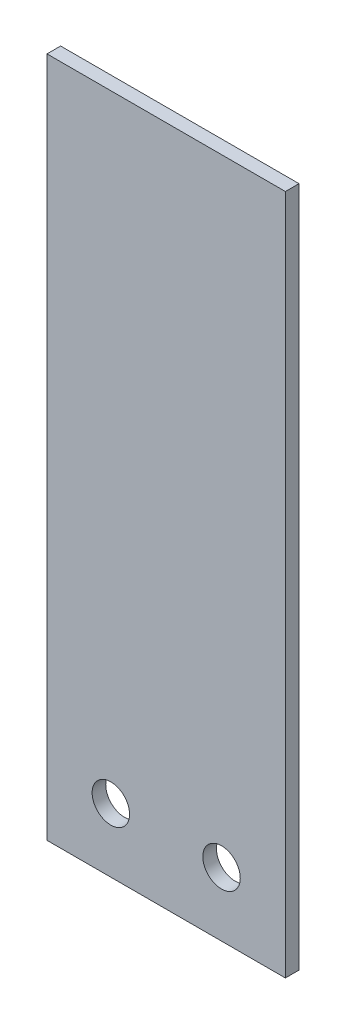
ISO-10303-21;
HEADER;
FILE_DESCRIPTION(('STEP AP214'),'2;1');
FILE_NAME('part.step','',(''),(''),'','','');
FILE_SCHEMA(('AUTOMOTIVE_DESIGN { 1 0 10303 214 1 1 1 1 }'));
ENDSEC;
DATA;
#1=APPLICATION_CONTEXT('core data for automotive mechanical design processes');
#2=APPLICATION_PROTOCOL_DEFINITION('international standard','automotive_design',2000,#1);
#3=PRODUCT_CONTEXT('',#1,'mechanical');
#4=PRODUCT('Part','Part','',(#3));
#5=PRODUCT_RELATED_PRODUCT_CATEGORY('part','',(#4));
#6=PRODUCT_DEFINITION_FORMATION('','',#4);
#7=PRODUCT_DEFINITION_CONTEXT('part definition',#1,'design');
#8=PRODUCT_DEFINITION('design','',#6,#7);
#9=PRODUCT_DEFINITION_SHAPE('','',#8);
#10=(LENGTH_UNIT() NAMED_UNIT(*) SI_UNIT(.MILLI.,.METRE.));
#11=(NAMED_UNIT(*) PLANE_ANGLE_UNIT() SI_UNIT($,.RADIAN.));
#12=(NAMED_UNIT(*) SI_UNIT($,.STERADIAN.) SOLID_ANGLE_UNIT());
#13=UNCERTAINTY_MEASURE_WITH_UNIT(LENGTH_MEASURE(1.E-05),#10,'distance_accuracy_value','');
#14=(GEOMETRIC_REPRESENTATION_CONTEXT(3) GLOBAL_UNCERTAINTY_ASSIGNED_CONTEXT((#13)) GLOBAL_UNIT_ASSIGNED_CONTEXT((#10,
#11,#12)) REPRESENTATION_CONTEXT('',''));
#15=CARTESIAN_POINT('',(0.,0.,0.));
#16=DIRECTION('',(0.,0.,1.));
#17=DIRECTION('',(1.,0.,0.));
#18=AXIS2_PLACEMENT_3D('',#15,#16,#17);
#19=CARTESIAN_POINT('',(14.,-40.,1.6));
#20=DIRECTION('',(-1.,0.,0.));
#21=DIRECTION('',(0.,0.,1.));
#22=AXIS2_PLACEMENT_3D('',#19,#20,#21);
#23=PLANE('',#22);
#24=DIRECTION('',(0.,1.,0.));
#25=VECTOR('',#24,1.);
#26=CARTESIAN_POINT('',(14.,-40.,0.));
#27=LINE('',#26,#25);
#28=CARTESIAN_POINT('',(14.,-40.,0.));
#29=VERTEX_POINT('',#28);
#30=CARTESIAN_POINT('',(14.,40.,0.));
#31=VERTEX_POINT('',#30);
#32=EDGE_CURVE('E103',#29,#31,#27,.T.);
#33=ORIENTED_EDGE('',*,*,#32,.T.);
#34=DIRECTION('',(0.,0.,-1.));
#35=VECTOR('',#34,1.);
#36=CARTESIAN_POINT('',(14.,40.,1.6));
#37=LINE('',#36,#35);
#38=CARTESIAN_POINT('',(14.,40.,1.6));
#39=VERTEX_POINT('',#38);
#40=EDGE_CURVE('E11',#39,#31,#37,.T.);
#41=ORIENTED_EDGE('',*,*,#40,.F.);
#42=DIRECTION('',(0.,1.,0.));
#43=VECTOR('',#42,1.);
#44=CARTESIAN_POINT('',(14.,-40.,1.6));
#45=LINE('',#44,#43);
#46=CARTESIAN_POINT('',(14.,-40.,1.6));
#47=VERTEX_POINT('',#46);
#48=EDGE_CURVE('E90',#47,#39,#45,.T.);
#49=ORIENTED_EDGE('',*,*,#48,.F.);
#50=DIRECTION('',(0.,0.,-1.));
#51=VECTOR('',#50,1.);
#52=CARTESIAN_POINT('',(14.,-40.,1.6));
#53=LINE('',#52,#51);
#54=EDGE_CURVE('E99',#47,#29,#53,.T.);
#55=ORIENTED_EDGE('',*,*,#54,.T.);
#56=EDGE_LOOP('',(#33,#41,#49,#55));
#57=FACE_BOUND('',#56,.T.);
#58=ADVANCED_FACE('F37',(#57),#23,.F.);
#59=CARTESIAN_POINT('',(-14.,40.,1.6));
#60=DIRECTION('',(0.,-1.,0.));
#61=DIRECTION('',(0.,0.,-1.));
#62=AXIS2_PLACEMENT_3D('',#59,#60,#61);
#63=PLANE('',#62);
#64=DIRECTION('',(-1.,0.,0.));
#65=VECTOR('',#64,1.);
#66=CARTESIAN_POINT('',(-14.,40.,0.));
#67=LINE('',#66,#65);
#68=CARTESIAN_POINT('',(-14.,40.,0.));
#69=VERTEX_POINT('',#68);
#70=EDGE_CURVE('E94',#31,#69,#67,.T.);
#71=ORIENTED_EDGE('',*,*,#70,.T.);
#72=DIRECTION('',(0.,0.,-1.));
#73=VECTOR('',#72,1.);
#74=CARTESIAN_POINT('',(-14.,40.,1.6));
#75=LINE('',#74,#73);
#76=CARTESIAN_POINT('',(-14.,40.,1.6));
#77=VERTEX_POINT('',#76);
#78=EDGE_CURVE('E46',#77,#69,#75,.T.);
#79=ORIENTED_EDGE('',*,*,#78,.F.);
#80=DIRECTION('',(-1.,0.,0.));
#81=VECTOR('',#80,1.);
#82=CARTESIAN_POINT('',(-14.,40.,1.6));
#83=LINE('',#82,#81);
#84=EDGE_CURVE('E85',#39,#77,#83,.T.);
#85=ORIENTED_EDGE('',*,*,#84,.F.);
#86=ORIENTED_EDGE('',*,*,#40,.T.);
#87=EDGE_LOOP('',(#71,#79,#85,#86));
#88=FACE_BOUND('',#87,.T.);
#89=ADVANCED_FACE('F93',(#88),#63,.F.);
#90=CARTESIAN_POINT('',(-14.,-40.,1.6));
#91=DIRECTION('',(1.,0.,0.));
#92=DIRECTION('',(0.,0.,-1.));
#93=AXIS2_PLACEMENT_3D('',#90,#91,#92);
#94=PLANE('',#93);
#95=DIRECTION('',(0.,-1.,0.));
#96=VECTOR('',#95,1.);
#97=CARTESIAN_POINT('',(-14.,-40.,0.));
#98=LINE('',#97,#96);
#99=CARTESIAN_POINT('',(-14.,-40.,0.));
#100=VERTEX_POINT('',#99);
#101=EDGE_CURVE('E72',#69,#100,#98,.T.);
#102=ORIENTED_EDGE('',*,*,#101,.T.);
#103=DIRECTION('',(0.,0.,-1.));
#104=VECTOR('',#103,1.);
#105=CARTESIAN_POINT('',(-14.,-40.,1.6));
#106=LINE('',#105,#104);
#107=CARTESIAN_POINT('',(-14.,-40.,1.6));
#108=VERTEX_POINT('',#107);
#109=EDGE_CURVE('E95',#108,#100,#106,.T.);
#110=ORIENTED_EDGE('',*,*,#109,.F.);
#111=DIRECTION('',(0.,-1.,0.));
#112=VECTOR('',#111,1.);
#113=CARTESIAN_POINT('',(-14.,-40.,1.6));
#114=LINE('',#113,#112);
#115=EDGE_CURVE('E88',#77,#108,#114,.T.);
#116=ORIENTED_EDGE('',*,*,#115,.F.);
#117=ORIENTED_EDGE('',*,*,#78,.T.);
#118=EDGE_LOOP('',(#102,#110,#116,#117));
#119=FACE_BOUND('',#118,.T.);
#120=ADVANCED_FACE('F97',(#119),#94,.F.);
#121=CARTESIAN_POINT('',(-14.,-40.,1.6));
#122=DIRECTION('',(0.,1.,0.));
#123=DIRECTION('',(0.,0.,1.));
#124=AXIS2_PLACEMENT_3D('',#121,#122,#123);
#125=PLANE('',#124);
#126=DIRECTION('',(1.,0.,0.));
#127=VECTOR('',#126,1.);
#128=CARTESIAN_POINT('',(-14.,-40.,0.));
#129=LINE('',#128,#127);
#130=EDGE_CURVE('E78',#100,#29,#129,.T.);
#131=ORIENTED_EDGE('',*,*,#130,.T.);
#132=ORIENTED_EDGE('',*,*,#54,.F.);
#133=DIRECTION('',(1.,0.,0.));
#134=VECTOR('',#133,1.);
#135=CARTESIAN_POINT('',(-14.,-40.,1.6));
#136=LINE('',#135,#134);
#137=EDGE_CURVE('E55',#108,#47,#136,.T.);
#138=ORIENTED_EDGE('',*,*,#137,.F.);
#139=ORIENTED_EDGE('',*,*,#109,.T.);
#140=EDGE_LOOP('',(#131,#132,#138,#139));
#141=FACE_BOUND('',#140,.T.);
#142=ADVANCED_FACE('F129',(#141),#125,.F.);
#143=CARTESIAN_POINT('',(0.,0.,1.6));
#144=DIRECTION('',(0.,0.,-1.));
#145=DIRECTION('',(-1.,0.,0.));
#146=AXIS2_PLACEMENT_3D('',#143,#144,#145);
#147=PLANE('',#146);
#148=CARTESIAN_POINT('',(6.5,-32.5,1.6));
#149=DIRECTION('',(0.,0.,1.));
#150=DIRECTION('',(1.,0.,0.));
#151=AXIS2_PLACEMENT_3D('',#148,#149,#150);
#152=CIRCLE('',#151,2.2);
#153=CARTESIAN_POINT('',(8.7,-32.5,1.6));
#154=VERTEX_POINT('',#153);
#155=EDGE_CURVE('E112',#154,#154,#152,.T.);
#156=ORIENTED_EDGE('',*,*,#155,.F.);
#157=EDGE_LOOP('',(#156));
#158=FACE_BOUND('',#157,.T.);
#159=CARTESIAN_POINT('',(-6.5,-32.5,1.6));
#160=DIRECTION('',(0.,0.,1.));
#161=DIRECTION('',(1.,0.,0.));
#162=AXIS2_PLACEMENT_3D('',#159,#160,#161);
#163=CIRCLE('',#162,2.2);
#164=CARTESIAN_POINT('',(-4.3,-32.5,1.6));
#165=VERTEX_POINT('',#164);
#166=EDGE_CURVE('E117',#165,#165,#163,.T.);
#167=ORIENTED_EDGE('',*,*,#166,.F.);
#168=EDGE_LOOP('',(#167));
#169=FACE_BOUND('',#168,.T.);
#170=ORIENTED_EDGE('',*,*,#48,.T.);
#171=ORIENTED_EDGE('',*,*,#84,.T.);
#172=ORIENTED_EDGE('',*,*,#115,.T.);
#173=ORIENTED_EDGE('',*,*,#137,.T.);
#174=EDGE_LOOP('',(#170,#171,#172,#173));
#175=FACE_BOUND('',#174,.T.);
#176=ADVANCED_FACE('F86',(#158,#169,#175),#147,.F.);
#177=CARTESIAN_POINT('',(0.,0.,0.));
#178=DIRECTION('',(0.,0.,-1.));
#179=DIRECTION('',(-1.,0.,0.));
#180=AXIS2_PLACEMENT_3D('',#177,#178,#179);
#181=PLANE('',#180);
#182=CARTESIAN_POINT('',(6.5,-32.5,0.));
#183=DIRECTION('',(0.,0.,-1.));
#184=DIRECTION('',(-1.,0.,0.));
#185=AXIS2_PLACEMENT_3D('',#182,#183,#184);
#186=CIRCLE('',#185,2.2);
#187=CARTESIAN_POINT('',(4.3,-32.5,0.));
#188=VERTEX_POINT('',#187);
#189=EDGE_CURVE('E40',#188,#188,#186,.T.);
#190=ORIENTED_EDGE('',*,*,#189,.F.);
#191=EDGE_LOOP('',(#190));
#192=FACE_BOUND('',#191,.T.);
#193=CARTESIAN_POINT('',(-6.5,-32.5,0.));
#194=DIRECTION('',(0.,0.,-1.));
#195=DIRECTION('',(-1.,0.,0.));
#196=AXIS2_PLACEMENT_3D('',#193,#194,#195);
#197=CIRCLE('',#196,2.2);
#198=CARTESIAN_POINT('',(-8.7,-32.5,0.));
#199=VERTEX_POINT('',#198);
#200=EDGE_CURVE('E110',#199,#199,#197,.T.);
#201=ORIENTED_EDGE('',*,*,#200,.F.);
#202=EDGE_LOOP('',(#201));
#203=FACE_BOUND('',#202,.T.);
#204=ORIENTED_EDGE('',*,*,#32,.F.);
#205=ORIENTED_EDGE('',*,*,#130,.F.);
#206=ORIENTED_EDGE('',*,*,#101,.F.);
#207=ORIENTED_EDGE('',*,*,#70,.F.);
#208=EDGE_LOOP('',(#204,#205,#206,#207));
#209=FACE_BOUND('',#208,.T.);
#210=ADVANCED_FACE('F128',(#192,#203,#209),#181,.T.);
#211=CARTESIAN_POINT('',(-6.5,-32.5,-8.4));
#212=DIRECTION('',(0.,0.,1.));
#213=DIRECTION('',(1.,0.,0.));
#214=AXIS2_PLACEMENT_3D('',#211,#212,#213);
#215=CYLINDRICAL_SURFACE('',#214,2.2);
#216=ORIENTED_EDGE('',*,*,#200,.T.);
#217=EDGE_LOOP('',(#216));
#218=FACE_BOUND('',#217,.T.);
#219=ORIENTED_EDGE('',*,*,#166,.T.);
#220=EDGE_LOOP('',(#219));
#221=FACE_BOUND('',#220,.T.);
#222=ADVANCED_FACE('F125',(#218,#221),#215,.F.);
#223=CARTESIAN_POINT('',(6.5,-32.5,-8.4));
#224=DIRECTION('',(0.,0.,1.));
#225=DIRECTION('',(1.,0.,0.));
#226=AXIS2_PLACEMENT_3D('',#223,#224,#225);
#227=CYLINDRICAL_SURFACE('',#226,2.2);
#228=ORIENTED_EDGE('',*,*,#189,.T.);
#229=EDGE_LOOP('',(#228));
#230=FACE_BOUND('',#229,.T.);
#231=ORIENTED_EDGE('',*,*,#155,.T.);
#232=EDGE_LOOP('',(#231));
#233=FACE_BOUND('',#232,.T.);
#234=ADVANCED_FACE('F179',(#230,#233),#227,.F.);
#235=CLOSED_SHELL('',(#58,#89,#120,#142,#176,#210,#222,#234));
#236=MANIFOLD_SOLID_BREP('B2',#235);
#237=ADVANCED_BREP_SHAPE_REPRESENTATION('',(#18,#236),#14);
#238=SHAPE_DEFINITION_REPRESENTATION(#9,#237);
ENDSEC;
END-ISO-10303-21;
